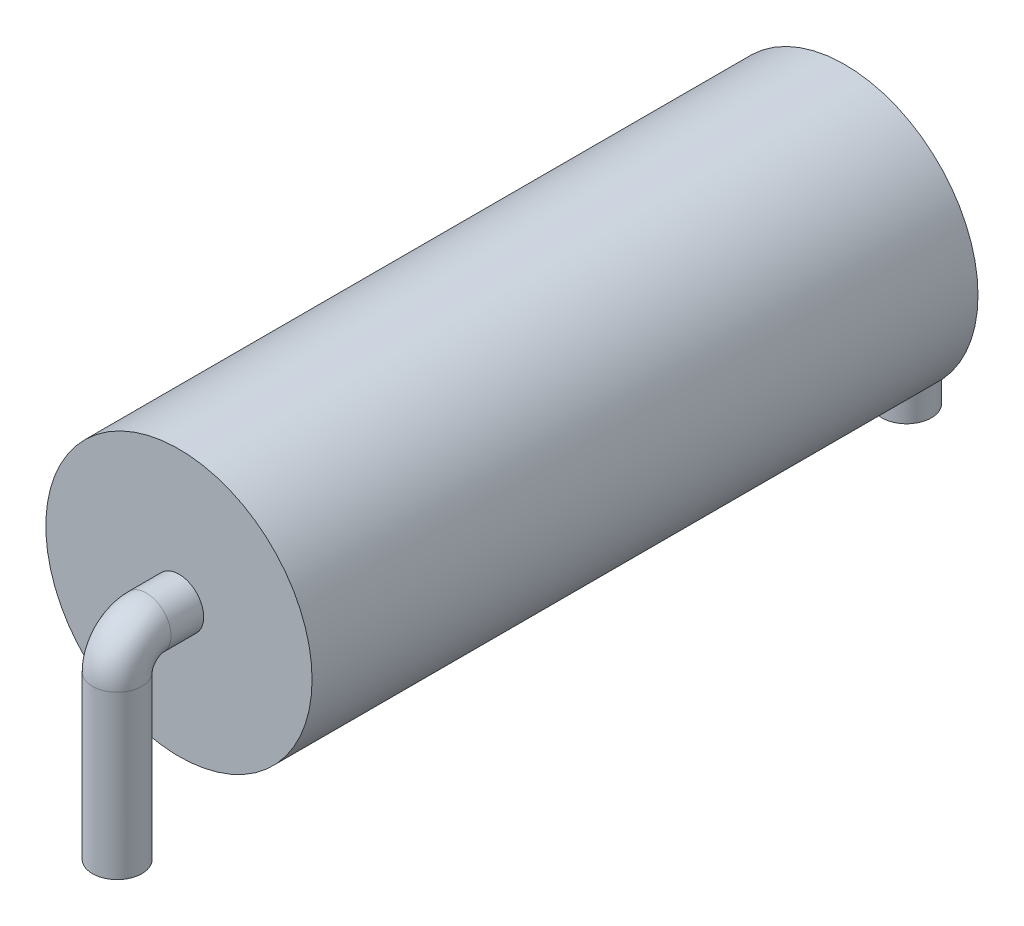
ISO-10303-21;
HEADER;
FILE_DESCRIPTION(('STEP AP214'),'2;1');
FILE_NAME('part.step','',(''),(''),'','','');
FILE_SCHEMA(('AUTOMOTIVE_DESIGN { 1 0 10303 214 1 1 1 1 }'));
ENDSEC;
DATA;
#1=APPLICATION_CONTEXT('core data for automotive mechanical design processes');
#2=APPLICATION_PROTOCOL_DEFINITION('international standard','automotive_design',2000,#1);
#3=PRODUCT_CONTEXT('',#1,'mechanical');
#4=PRODUCT('Part','Part','',(#3));
#5=PRODUCT_RELATED_PRODUCT_CATEGORY('part','',(#4));
#6=PRODUCT_DEFINITION_FORMATION('','',#4);
#7=PRODUCT_DEFINITION_CONTEXT('part definition',#1,'design');
#8=PRODUCT_DEFINITION('design','',#6,#7);
#9=PRODUCT_DEFINITION_SHAPE('','',#8);
#10=(LENGTH_UNIT() NAMED_UNIT(*) SI_UNIT(.MILLI.,.METRE.));
#11=(NAMED_UNIT(*) PLANE_ANGLE_UNIT() SI_UNIT($,.RADIAN.));
#12=(NAMED_UNIT(*) SI_UNIT($,.STERADIAN.) SOLID_ANGLE_UNIT());
#13=UNCERTAINTY_MEASURE_WITH_UNIT(LENGTH_MEASURE(1.E-05),#10,'distance_accuracy_value','');
#14=(GEOMETRIC_REPRESENTATION_CONTEXT(3) GLOBAL_UNCERTAINTY_ASSIGNED_CONTEXT((#13)) GLOBAL_UNIT_ASSIGNED_CONTEXT((#10,
#11,#12)) REPRESENTATION_CONTEXT('',''));
#15=CARTESIAN_POINT('',(0.,0.,0.));
#16=DIRECTION('',(0.,0.,1.));
#17=DIRECTION('',(1.,0.,0.));
#18=AXIS2_PLACEMENT_3D('',#15,#16,#17);
#19=CARTESIAN_POINT('',(0.,0.,5.715));
#20=DIRECTION('',(0.,0.,-1.));
#21=DIRECTION('',(-1.,0.,0.));
#22=AXIS2_PLACEMENT_3D('',#19,#20,#21);
#23=CYLINDRICAL_SURFACE('',#22,2.285);
#24=CARTESIAN_POINT('',(0.,0.,5.715));
#25=DIRECTION('',(0.,0.,1.));
#26=DIRECTION('',(1.,0.,0.));
#27=AXIS2_PLACEMENT_3D('',#24,#25,#26);
#28=CIRCLE('',#27,2.285);
#29=CARTESIAN_POINT('',(2.285,0.,5.715));
#30=VERTEX_POINT('',#29);
#31=EDGE_CURVE('E55',#30,#30,#28,.T.);
#32=ORIENTED_EDGE('',*,*,#31,.F.);
#33=EDGE_LOOP('',(#32));
#34=FACE_BOUND('',#33,.T.);
#35=CARTESIAN_POINT('',(0.,0.,-5.715));
#36=DIRECTION('',(0.,0.,1.));
#37=DIRECTION('',(1.,0.,0.));
#38=AXIS2_PLACEMENT_3D('',#35,#36,#37);
#39=CIRCLE('',#38,2.285);
#40=CARTESIAN_POINT('',(2.285,0.,-5.715));
#41=VERTEX_POINT('',#40);
#42=EDGE_CURVE('E59',#41,#41,#39,.T.);
#43=ORIENTED_EDGE('',*,*,#42,.T.);
#44=EDGE_LOOP('',(#43));
#45=FACE_BOUND('',#44,.T.);
#46=ADVANCED_FACE('F49',(#34,#45),#23,.T.);
#47=CARTESIAN_POINT('',(0.,0.,5.715));
#48=DIRECTION('',(0.,0.,1.));
#49=DIRECTION('',(1.,0.,0.));
#50=AXIS2_PLACEMENT_3D('',#47,#48,#49);
#51=PLANE('',#50);
#52=CARTESIAN_POINT('',(0.,0.,5.715));
#53=DIRECTION('',(0.,0.,1.));
#54=DIRECTION('',(1.,0.,0.));
#55=AXIS2_PLACEMENT_3D('',#52,#53,#54);
#56=CIRCLE('',#55,0.425);
#57=CARTESIAN_POINT('',(0.425,0.,5.715));
#58=VERTEX_POINT('',#57);
#59=EDGE_CURVE('E64',#58,#58,#56,.F.);
#60=ORIENTED_EDGE('',*,*,#59,.T.);
#61=EDGE_LOOP('',(#60));
#62=FACE_BOUND('',#61,.T.);
#63=ORIENTED_EDGE('',*,*,#31,.T.);
#64=EDGE_LOOP('',(#63));
#65=FACE_BOUND('',#64,.T.);
#66=ADVANCED_FACE('F104',(#62,#65),#51,.T.);
#67=CARTESIAN_POINT('',(0.,0.,-5.715));
#68=DIRECTION('',(0.,0.,1.));
#69=DIRECTION('',(1.,0.,0.));
#70=AXIS2_PLACEMENT_3D('',#67,#68,#69);
#71=PLANE('',#70);
#72=CARTESIAN_POINT('',(0.,0.,-5.715));
#73=DIRECTION('',(0.,0.,1.));
#74=DIRECTION('',(1.,0.,0.));
#75=AXIS2_PLACEMENT_3D('',#72,#73,#74);
#76=CIRCLE('',#75,0.425);
#77=CARTESIAN_POINT('',(0.425,0.,-5.715));
#78=VERTEX_POINT('',#77);
#79=EDGE_CURVE('E11',#78,#78,#76,.F.);
#80=ORIENTED_EDGE('',*,*,#79,.F.);
#81=EDGE_LOOP('',(#80));
#82=FACE_BOUND('',#81,.T.);
#83=ORIENTED_EDGE('',*,*,#42,.F.);
#84=EDGE_LOOP('',(#83));
#85=FACE_BOUND('',#84,.T.);
#86=ADVANCED_FACE('F109',(#82,#85),#71,.F.);
#87=CARTESIAN_POINT('',(0.,-3.285,-6.775));
#88=DIRECTION('',(0.,1.,0.));
#89=DIRECTION('',(0.,0.,1.));
#90=AXIS2_PLACEMENT_3D('',#87,#88,#89);
#91=PLANE('',#90);
#92=CARTESIAN_POINT('',(0.,-3.285,-6.775));
#93=DIRECTION('',(0.,1.,0.));
#94=DIRECTION('',(0.,0.,1.));
#95=AXIS2_PLACEMENT_3D('',#92,#93,#94);
#96=CIRCLE('',#95,0.425);
#97=CARTESIAN_POINT('',(0.,-3.285,-6.35));
#98=VERTEX_POINT('',#97);
#99=EDGE_CURVE('E68',#98,#98,#96,.T.);
#100=ORIENTED_EDGE('',*,*,#99,.F.);
#101=EDGE_LOOP('',(#100));
#102=FACE_BOUND('',#101,.T.);
#103=ADVANCED_FACE('F116',(#102),#91,.F.);
#104=CARTESIAN_POINT('',(0.,-0.5,-6.775));
#105=DIRECTION('',(0.,-1.,0.));
#106=DIRECTION('',(0.,0.,-1.));
#107=AXIS2_PLACEMENT_3D('',#104,#105,#106);
#108=CYLINDRICAL_SURFACE('',#107,0.425);
#109=ORIENTED_EDGE('',*,*,#99,.T.);
#110=EDGE_LOOP('',(#109));
#111=FACE_BOUND('',#110,.T.);
#112=CARTESIAN_POINT('',(0.,-0.500000000000002,-6.775));
#113=DIRECTION('',(0.,1.,0.));
#114=DIRECTION('',(0.,0.,1.));
#115=AXIS2_PLACEMENT_3D('',#112,#113,#114);
#116=CIRCLE('',#115,0.425);
#117=CARTESIAN_POINT('',(0.,-0.500000000000003,-7.2));
#118=VERTEX_POINT('',#117);
#119=EDGE_CURVE('E71',#118,#118,#116,.T.);
#120=ORIENTED_EDGE('',*,*,#119,.F.);
#121=EDGE_LOOP('',(#120));
#122=FACE_BOUND('',#121,.T.);
#123=ADVANCED_FACE('F121',(#111,#122),#108,.T.);
#124=CARTESIAN_POINT('',(0.,-0.500000000000001,-6.275));
#125=DIRECTION('',(-1.,0.,0.));
#126=DIRECTION('',(0.,0.,1.));
#127=AXIS2_PLACEMENT_3D('',#124,#125,#126);
#128=TOROIDAL_SURFACE('',#127,0.499999999999999,0.425);
#129=CARTESIAN_POINT('',(0.,0.,-6.275));
#130=DIRECTION('',(0.,0.,1.));
#131=DIRECTION('',(0.,-1.,0.));
#132=AXIS2_PLACEMENT_3D('',#129,#130,#131);
#133=CIRCLE('',#132,0.425);
#134=CARTESIAN_POINT('',(0.,0.424999999999998,-6.275));
#135=VERTEX_POINT('',#134);
#136=EDGE_CURVE('E74',#135,#135,#133,.T.);
#137=CARTESIAN_POINT('',(0.,-0.500000000000001,-6.275));
#138=DIRECTION('',(-1.,0.,0.));
#139=DIRECTION('',(0.,0.,1.));
#140=AXIS2_PLACEMENT_3D('',#137,#138,#139);
#141=CIRCLE('',#140,0.924999999999999);
#142=EDGE_CURVE('',#135,#118,#141,.T.);
#143=ORIENTED_EDGE('',*,*,#136,.F.);
#144=ORIENTED_EDGE('',*,*,#119,.T.);
#145=ORIENTED_EDGE('',*,*,#142,.T.);
#146=ORIENTED_EDGE('',*,*,#142,.F.);
#147=EDGE_LOOP('',(#143,#145,#144,#146));
#148=FACE_BOUND('',#147,.T.);
#149=ADVANCED_FACE('F127',(#148),#128,.T.);
#150=CARTESIAN_POINT('',(0.,0.,6.275));
#151=DIRECTION('',(0.,0.,-1.));
#152=DIRECTION('',(-1.,0.,0.));
#153=AXIS2_PLACEMENT_3D('',#150,#151,#152);
#154=CYLINDRICAL_SURFACE('',#153,0.425);
#155=ORIENTED_EDGE('',*,*,#136,.T.);
#156=EDGE_LOOP('',(#155));
#157=FACE_BOUND('',#156,.T.);
#158=ORIENTED_EDGE('',*,*,#79,.T.);
#159=EDGE_LOOP('',(#158));
#160=FACE_BOUND('',#159,.T.);
#161=ADVANCED_FACE('F101',(#157,#160),#154,.T.);
#162=CARTESIAN_POINT('',(0.,-3.285,6.775));
#163=DIRECTION('',(0.,-1.,0.));
#164=DIRECTION('',(0.,0.,-1.));
#165=AXIS2_PLACEMENT_3D('',#162,#163,#164);
#166=PLANE('',#165);
#167=CARTESIAN_POINT('',(0.,-3.285,6.775));
#168=DIRECTION('',(0.,-1.,0.));
#169=DIRECTION('',(0.,0.,-1.));
#170=AXIS2_PLACEMENT_3D('',#167,#168,#169);
#171=CIRCLE('',#170,0.425);
#172=CARTESIAN_POINT('',(0.,-3.285,6.35));
#173=VERTEX_POINT('',#172);
#174=EDGE_CURVE('E83',#173,#173,#171,.T.);
#175=ORIENTED_EDGE('',*,*,#174,.T.);
#176=EDGE_LOOP('',(#175));
#177=FACE_BOUND('',#176,.T.);
#178=ADVANCED_FACE('F87',(#177),#166,.T.);
#179=CARTESIAN_POINT('',(0.,-3.285,6.775));
#180=DIRECTION('',(0.,1.,0.));
#181=DIRECTION('',(0.,0.,1.));
#182=AXIS2_PLACEMENT_3D('',#179,#180,#181);
#183=CYLINDRICAL_SURFACE('',#182,0.425);
#184=CARTESIAN_POINT('',(0.,-0.500000000000001,6.775));
#185=DIRECTION('',(0.,-1.,0.));
#186=DIRECTION('',(0.,0.,-1.));
#187=AXIS2_PLACEMENT_3D('',#184,#185,#186);
#188=CIRCLE('',#187,0.425);
#189=CARTESIAN_POINT('',(0.,-0.500000000000001,7.2));
#190=VERTEX_POINT('',#189);
#191=EDGE_CURVE('E80',#190,#190,#188,.T.);
#192=ORIENTED_EDGE('',*,*,#191,.T.);
#193=EDGE_LOOP('',(#192));
#194=FACE_BOUND('',#193,.T.);
#195=ORIENTED_EDGE('',*,*,#174,.F.);
#196=EDGE_LOOP('',(#195));
#197=FACE_BOUND('',#196,.T.);
#198=ADVANCED_FACE('F89',(#194,#197),#183,.T.);
#199=CARTESIAN_POINT('',(0.,-0.500000000000001,6.275));
#200=DIRECTION('',(-1.,0.,0.));
#201=DIRECTION('',(0.,0.,1.));
#202=AXIS2_PLACEMENT_3D('',#199,#200,#201);
#203=TOROIDAL_SURFACE('',#202,0.5,0.425);
#204=CARTESIAN_POINT('',(0.,0.,6.275));
#205=DIRECTION('',(0.,0.,1.));
#206=DIRECTION('',(0.,-1.,0.));
#207=AXIS2_PLACEMENT_3D('',#204,#205,#206);
#208=CIRCLE('',#207,0.425);
#209=CARTESIAN_POINT('',(0.,0.424999999999999,6.275));
#210=VERTEX_POINT('',#209);
#211=EDGE_CURVE('E77',#210,#210,#208,.T.);
#212=CARTESIAN_POINT('',(0.,-0.500000000000001,6.275));
#213=DIRECTION('',(-1.,0.,0.));
#214=DIRECTION('',(0.,0.,1.));
#215=AXIS2_PLACEMENT_3D('',#212,#213,#214);
#216=CIRCLE('',#215,0.925);
#217=EDGE_CURVE('',#190,#210,#216,.T.);
#218=ORIENTED_EDGE('',*,*,#191,.F.);
#219=ORIENTED_EDGE('',*,*,#211,.T.);
#220=ORIENTED_EDGE('',*,*,#217,.T.);
#221=ORIENTED_EDGE('',*,*,#217,.F.);
#222=EDGE_LOOP('',(#218,#220,#219,#221));
#223=FACE_BOUND('',#222,.T.);
#224=ADVANCED_FACE('F91',(#223),#203,.T.);
#225=ORIENTED_EDGE('',*,*,#59,.F.);
#226=EDGE_LOOP('',(#225));
#227=FACE_BOUND('',#226,.T.);
#228=ORIENTED_EDGE('',*,*,#211,.F.);
#229=EDGE_LOOP('',(#228));
#230=FACE_BOUND('',#229,.T.);
#231=ADVANCED_FACE('F98',(#227,#230),#154,.T.);
#232=CLOSED_SHELL('',(#46,#66,#86,#103,#123,#149,#161,#178,#198,#224,#231));
#233=MANIFOLD_SOLID_BREP('B2',#232);
#234=ADVANCED_BREP_SHAPE_REPRESENTATION('',(#18,#233),#14);
#235=SHAPE_DEFINITION_REPRESENTATION(#9,#234);
ENDSEC;
END-ISO-10303-21;
